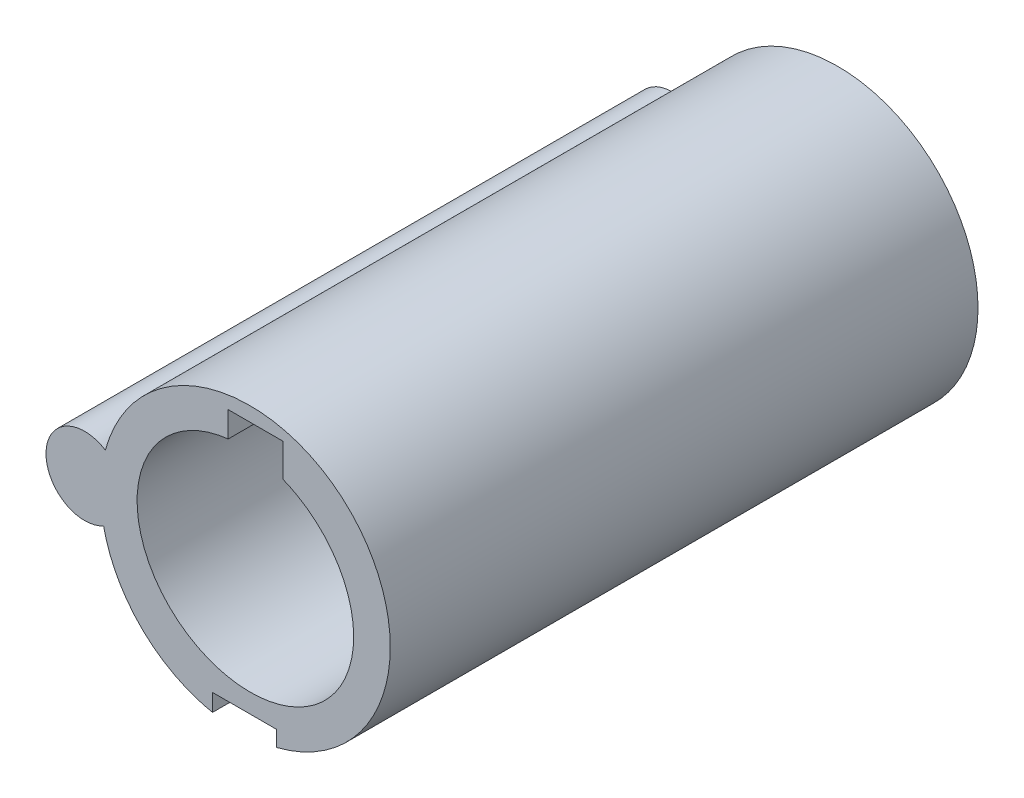
ISO-10303-21;
HEADER;
FILE_DESCRIPTION(('STEP AP214'),'2;1');
FILE_NAME('part.step','',(''),(''),'','','');
FILE_SCHEMA(('AUTOMOTIVE_DESIGN { 1 0 10303 214 1 1 1 1 }'));
ENDSEC;
DATA;
#1=APPLICATION_CONTEXT('core data for automotive mechanical design processes');
#2=APPLICATION_PROTOCOL_DEFINITION('international standard','automotive_design',2000,#1);
#3=PRODUCT_CONTEXT('',#1,'mechanical');
#4=PRODUCT('Part','Part','',(#3));
#5=PRODUCT_RELATED_PRODUCT_CATEGORY('part','',(#4));
#6=PRODUCT_DEFINITION_FORMATION('','',#4);
#7=PRODUCT_DEFINITION_CONTEXT('part definition',#1,'design');
#8=PRODUCT_DEFINITION('design','',#6,#7);
#9=PRODUCT_DEFINITION_SHAPE('','',#8);
#10=(LENGTH_UNIT() NAMED_UNIT(*) SI_UNIT(.MILLI.,.METRE.));
#11=(NAMED_UNIT(*) PLANE_ANGLE_UNIT() SI_UNIT($,.RADIAN.));
#12=(NAMED_UNIT(*) SI_UNIT($,.STERADIAN.) SOLID_ANGLE_UNIT());
#13=UNCERTAINTY_MEASURE_WITH_UNIT(LENGTH_MEASURE(1.E-05),#10,'distance_accuracy_value','');
#14=(GEOMETRIC_REPRESENTATION_CONTEXT(3) GLOBAL_UNCERTAINTY_ASSIGNED_CONTEXT((#13)) GLOBAL_UNIT_ASSIGNED_CONTEXT((#10,
#11,#12)) REPRESENTATION_CONTEXT('',''));
#15=CARTESIAN_POINT('',(0.,0.,0.));
#16=DIRECTION('',(0.,0.,1.));
#17=DIRECTION('',(1.,0.,0.));
#18=AXIS2_PLACEMENT_3D('',#15,#16,#17);
#19=CARTESIAN_POINT('',(0.,0.,170.));
#20=DIRECTION('',(0.,0.,1.));
#21=DIRECTION('',(0.795431720032498,0.606043215262857,0.));
#22=AXIS2_PLACEMENT_3D('',#19,#20,#21);
#23=ELLIPSE('',#22,42.3968647187602,41.0291122225245);
#24=DIRECTION('',(0.,0.,-1.));
#25=VECTOR('',#24,1.);
#26=SURFACE_OF_LINEAR_EXTRUSION('',#23,#25);
#27=CARTESIAN_POINT('',(0.,0.,0.));
#28=DIRECTION('',(0.,0.,1.));
#29=DIRECTION('',(0.795431720032498,0.606043215262857,0.));
#30=AXIS2_PLACEMENT_3D('',#27,#28,#29);
#31=ELLIPSE('',#30,42.3968647187602,41.0291122225245);
#32=CARTESIAN_POINT('',(9.05597585206664,-40.2509189524476,0.));
#33=VERTEX_POINT('',#32);
#34=CARTESIAN_POINT('',(-40.4798539783786,9.44768805392926,0.));
#35=VERTEX_POINT('',#34);
#36=EDGE_CURVE('E120',#33,#35,#31,.T.);
#37=ORIENTED_EDGE('',*,*,#36,.T.);
#38=DIRECTION('',(0.,0.,-1.));
#39=VECTOR('',#38,1.);
#40=CARTESIAN_POINT('',(-40.4798539783786,9.44768805392926,170.));
#41=LINE('',#40,#39);
#42=CARTESIAN_POINT('',(-40.4798539783786,9.44768805392926,170.));
#43=VERTEX_POINT('',#42);
#44=EDGE_CURVE('E11',#35,#43,#41,.F.);
#45=ORIENTED_EDGE('',*,*,#44,.T.);
#46=CARTESIAN_POINT('',(9.05597585206668,-40.2509189524476,170.));
#47=VERTEX_POINT('',#46);
#48=EDGE_CURVE('E118',#47,#43,#23,.T.);
#49=ORIENTED_EDGE('',*,*,#48,.F.);
#50=DIRECTION('',(0.,0.,-1.));
#51=VECTOR('',#50,1.);
#52=CARTESIAN_POINT('',(9.05597585206667,-40.2509189524476,170.));
#53=LINE('',#52,#51);
#54=EDGE_CURVE('E138',#47,#33,#53,.T.);
#55=ORIENTED_EDGE('',*,*,#54,.T.);
#56=EDGE_LOOP('',(#37,#45,#49,#55));
#57=FACE_BOUND('',#56,.T.);
#58=ADVANCED_FACE('F33',(#57),#26,.F.);
#59=CARTESIAN_POINT('',(0.,0.,170.));
#60=DIRECTION('',(0.,0.,1.));
#61=DIRECTION('',(1.,0.,0.));
#62=AXIS2_PLACEMENT_3D('',#59,#60,#61);
#63=PLANE('',#62);
#64=ORIENTED_EDGE('',*,*,#48,.T.);
#65=CARTESIAN_POINT('',(-46.4822943247072,0.,170.));
#66=DIRECTION('',(0.,0.,1.));
#67=DIRECTION('',(1.,0.,0.));
#68=AXIS2_PLACEMENT_3D('',#65,#66,#67);
#69=CIRCLE('',#68,11.1932166813473);
#70=CARTESIAN_POINT('',(-41.0158018376796,-9.76757695464242,170.));
#71=VERTEX_POINT('',#70);
#72=EDGE_CURVE('E49',#43,#71,#69,.T.);
#73=ORIENTED_EDGE('',*,*,#72,.T.);
#74=CARTESIAN_POINT('',(-9.4977307716797,-40.7328716216063,170.));
#75=VERTEX_POINT('',#74);
#76=EDGE_CURVE('E127',#71,#75,#23,.T.);
#77=ORIENTED_EDGE('',*,*,#76,.T.);
#78=DIRECTION('',(0.,-1.,0.));
#79=VECTOR('',#78,1.);
#80=CARTESIAN_POINT('',(-9.4977307716797,-35.7269291237015,170.));
#81=LINE('',#80,#79);
#82=CARTESIAN_POINT('',(-9.4977307716797,-35.7269291237015,170.));
#83=VERTEX_POINT('',#82);
#84=EDGE_CURVE('E303',#83,#75,#81,.T.);
#85=ORIENTED_EDGE('',*,*,#84,.F.);
#86=DIRECTION('',(-1.,0.,0.));
#87=VECTOR('',#86,1.);
#88=CARTESIAN_POINT('',(-9.4977307716797,-35.7269291237015,170.));
#89=LINE('',#88,#87);
#90=CARTESIAN_POINT('',(9.05597585206668,-35.7269291237015,170.));
#91=VERTEX_POINT('',#90);
#92=EDGE_CURVE('E299',#91,#83,#89,.T.);
#93=ORIENTED_EDGE('',*,*,#92,.F.);
#94=DIRECTION('',(0.,1.,0.));
#95=VECTOR('',#94,1.);
#96=CARTESIAN_POINT('',(9.05597585206668,-35.7269291237015,170.));
#97=LINE('',#96,#95);
#98=EDGE_CURVE('E125',#47,#91,#97,.T.);
#99=ORIENTED_EDGE('',*,*,#98,.F.);
#100=EDGE_LOOP('',(#64,#73,#77,#85,#93,#99));
#101=FACE_BOUND('',#100,.T.);
#102=DIRECTION('',(0.,-1.,0.));
#103=VECTOR('',#102,1.);
#104=CARTESIAN_POINT('',(-4.96974284564636,37.3835100722515,170.));
#105=LINE('',#104,#103);
#106=CARTESIAN_POINT('',(-4.96974284564636,37.3835100722515,170.));
#107=VERTEX_POINT('',#106);
#108=CARTESIAN_POINT('',(-4.96974284564636,30.0232337636321,170.));
#109=VERTEX_POINT('',#108);
#110=EDGE_CURVE('E276',#107,#109,#105,.T.);
#111=ORIENTED_EDGE('',*,*,#110,.F.);
#112=DIRECTION('',(-1.,0.,0.));
#113=VECTOR('',#112,1.);
#114=CARTESIAN_POINT('',(-4.96974284564636,37.3835100722515,170.));
#115=LINE('',#114,#113);
#116=CARTESIAN_POINT('',(10.8229955305187,37.3835100722515,170.));
#117=VERTEX_POINT('',#116);
#118=EDGE_CURVE('E282',#117,#107,#115,.T.);
#119=ORIENTED_EDGE('',*,*,#118,.F.);
#120=DIRECTION('',(0.,1.,0.));
#121=VECTOR('',#120,1.);
#122=CARTESIAN_POINT('',(10.8229955305187,37.3835100722515,170.));
#123=LINE('',#122,#121);
#124=CARTESIAN_POINT('',(10.8229955305187,27.8588450600018,170.));
#125=VERTEX_POINT('',#124);
#126=EDGE_CURVE('E285',#125,#117,#123,.T.);
#127=ORIENTED_EDGE('',*,*,#126,.F.);
#128=CARTESIAN_POINT('',(0.,0.,170.));
#129=DIRECTION('',(0.,0.,1.));
#130=DIRECTION('',(0.900460492349972,-0.434937813620344,0.));
#131=AXIS2_PLACEMENT_3D('',#128,#129,#130);
#132=ELLIPSE('',#131,31.6486344608763,29.8770924369327);
#133=EDGE_CURVE('E152',#109,#125,#132,.T.);
#134=ORIENTED_EDGE('',*,*,#133,.F.);
#135=EDGE_LOOP('',(#111,#119,#127,#134));
#136=FACE_BOUND('',#135,.T.);
#137=ADVANCED_FACE('F122',(#101,#136),#63,.T.);
#138=CARTESIAN_POINT('',(0.,0.,0.));
#139=DIRECTION('',(0.,0.,1.));
#140=DIRECTION('',(1.,0.,0.));
#141=AXIS2_PLACEMENT_3D('',#138,#139,#140);
#142=PLANE('',#141);
#143=CARTESIAN_POINT('',(-41.0158018376796,-9.76757695464241,0.));
#144=VERTEX_POINT('',#143);
#145=CARTESIAN_POINT('',(-9.4977307716797,-40.7328716216063,0.));
#146=VERTEX_POINT('',#145);
#147=EDGE_CURVE('E135',#144,#146,#31,.T.);
#148=ORIENTED_EDGE('',*,*,#147,.F.);
#149=CARTESIAN_POINT('',(-46.4822943247072,0.,0.));
#150=DIRECTION('',(0.,0.,1.));
#151=DIRECTION('',(1.,0.,0.));
#152=AXIS2_PLACEMENT_3D('',#149,#150,#151);
#153=CIRCLE('',#152,11.1932166813473);
#154=EDGE_CURVE('E113',#35,#144,#153,.T.);
#155=ORIENTED_EDGE('',*,*,#154,.F.);
#156=ORIENTED_EDGE('',*,*,#36,.F.);
#157=DIRECTION('',(0.,1.,0.));
#158=VECTOR('',#157,1.);
#159=CARTESIAN_POINT('',(9.05597585206668,-35.7269291237015,0.));
#160=LINE('',#159,#158);
#161=CARTESIAN_POINT('',(9.05597585206668,-35.7269291237015,0.));
#162=VERTEX_POINT('',#161);
#163=EDGE_CURVE('E57',#33,#162,#160,.T.);
#164=ORIENTED_EDGE('',*,*,#163,.T.);
#165=DIRECTION('',(-1.,0.,0.));
#166=VECTOR('',#165,1.);
#167=CARTESIAN_POINT('',(-9.4977307716797,-35.7269291237015,0.));
#168=LINE('',#167,#166);
#169=CARTESIAN_POINT('',(-9.4977307716797,-35.7269291237015,0.));
#170=VERTEX_POINT('',#169);
#171=EDGE_CURVE('E301',#162,#170,#168,.T.);
#172=ORIENTED_EDGE('',*,*,#171,.T.);
#173=DIRECTION('',(0.,-1.,0.));
#174=VECTOR('',#173,1.);
#175=CARTESIAN_POINT('',(-9.4977307716797,-35.7269291237015,0.));
#176=LINE('',#175,#174);
#177=EDGE_CURVE('E151',#170,#146,#176,.T.);
#178=ORIENTED_EDGE('',*,*,#177,.T.);
#179=EDGE_LOOP('',(#148,#155,#156,#164,#172,#178));
#180=FACE_BOUND('',#179,.T.);
#181=DIRECTION('',(-1.,0.,0.));
#182=VECTOR('',#181,1.);
#183=CARTESIAN_POINT('',(-4.96974284564636,37.3835100722515,0.));
#184=LINE('',#183,#182);
#185=CARTESIAN_POINT('',(10.8229955305187,37.3835100722515,0.));
#186=VERTEX_POINT('',#185);
#187=CARTESIAN_POINT('',(-4.96974284564636,37.3835100722515,0.));
#188=VERTEX_POINT('',#187);
#189=EDGE_CURVE('E280',#186,#188,#184,.T.);
#190=ORIENTED_EDGE('',*,*,#189,.T.);
#191=DIRECTION('',(0.,-1.,0.));
#192=VECTOR('',#191,1.);
#193=CARTESIAN_POINT('',(-4.96974284564636,37.3835100722515,0.));
#194=LINE('',#193,#192);
#195=CARTESIAN_POINT('',(-4.96974284564636,30.0232337636321,0.));
#196=VERTEX_POINT('',#195);
#197=EDGE_CURVE('E273',#188,#196,#194,.T.);
#198=ORIENTED_EDGE('',*,*,#197,.T.);
#199=CARTESIAN_POINT('',(0.,0.,0.));
#200=DIRECTION('',(0.,0.,1.));
#201=DIRECTION('',(0.900460492349972,-0.434937813620344,0.));
#202=AXIS2_PLACEMENT_3D('',#199,#200,#201);
#203=ELLIPSE('',#202,31.6486344608763,29.8770924369327);
#204=CARTESIAN_POINT('',(10.8229955305187,27.8588450600018,0.));
#205=VERTEX_POINT('',#204);
#206=EDGE_CURVE('E133',#196,#205,#203,.T.);
#207=ORIENTED_EDGE('',*,*,#206,.T.);
#208=DIRECTION('',(0.,1.,0.));
#209=VECTOR('',#208,1.);
#210=CARTESIAN_POINT('',(10.8229955305187,37.3835100722515,0.));
#211=LINE('',#210,#209);
#212=EDGE_CURVE('E281',#205,#186,#211,.T.);
#213=ORIENTED_EDGE('',*,*,#212,.T.);
#214=EDGE_LOOP('',(#190,#198,#207,#213));
#215=FACE_BOUND('',#214,.T.);
#216=ADVANCED_FACE('F147',(#180,#215),#142,.F.);
#217=ORIENTED_EDGE('',*,*,#76,.F.);
#218=DIRECTION('',(0.,0.,-1.));
#219=VECTOR('',#218,1.);
#220=CARTESIAN_POINT('',(-41.0158018376796,-9.76757695464242,170.));
#221=LINE('',#220,#219);
#222=EDGE_CURVE('E42',#71,#144,#221,.T.);
#223=ORIENTED_EDGE('',*,*,#222,.T.);
#224=ORIENTED_EDGE('',*,*,#147,.T.);
#225=DIRECTION('',(0.,0.,-1.));
#226=VECTOR('',#225,1.);
#227=CARTESIAN_POINT('',(-9.4977307716797,-40.7328716216063,170.));
#228=LINE('',#227,#226);
#229=EDGE_CURVE('E140',#146,#75,#228,.F.);
#230=ORIENTED_EDGE('',*,*,#229,.T.);
#231=EDGE_LOOP('',(#217,#223,#224,#230));
#232=FACE_BOUND('',#231,.T.);
#233=ADVANCED_FACE('F35',(#232),#26,.F.);
#234=DIRECTION('',(0.,0.,-1.));
#235=VECTOR('',#234,1.);
#236=SURFACE_OF_LINEAR_EXTRUSION('',#132,#235);
#237=DIRECTION('',(0.,0.,-1.));
#238=VECTOR('',#237,1.);
#239=CARTESIAN_POINT('',(-4.96974284564636,30.0232337636321,170.));
#240=LINE('',#239,#238);
#241=EDGE_CURVE('E128',#109,#196,#240,.T.);
#242=ORIENTED_EDGE('',*,*,#241,.F.);
#243=ORIENTED_EDGE('',*,*,#133,.T.);
#244=DIRECTION('',(0.,0.,-1.));
#245=VECTOR('',#244,1.);
#246=CARTESIAN_POINT('',(10.8229955305187,27.8588450600018,170.));
#247=LINE('',#246,#245);
#248=EDGE_CURVE('E126',#205,#125,#247,.F.);
#249=ORIENTED_EDGE('',*,*,#248,.F.);
#250=ORIENTED_EDGE('',*,*,#206,.F.);
#251=EDGE_LOOP('',(#242,#243,#249,#250));
#252=FACE_BOUND('',#251,.T.);
#253=ADVANCED_FACE('F165',(#252),#236,.T.);
#254=CARTESIAN_POINT('',(-4.96974284564636,37.3835100722515,0.));
#255=DIRECTION('',(-1.,0.,0.));
#256=DIRECTION('',(0.,0.,1.));
#257=AXIS2_PLACEMENT_3D('',#254,#255,#256);
#258=PLANE('',#257);
#259=ORIENTED_EDGE('',*,*,#241,.T.);
#260=ORIENTED_EDGE('',*,*,#197,.F.);
#261=DIRECTION('',(0.,0.,1.));
#262=VECTOR('',#261,1.);
#263=CARTESIAN_POINT('',(-4.96974284564636,37.3835100722515,0.));
#264=LINE('',#263,#262);
#265=EDGE_CURVE('E159',#188,#107,#264,.T.);
#266=ORIENTED_EDGE('',*,*,#265,.T.);
#267=ORIENTED_EDGE('',*,*,#110,.T.);
#268=EDGE_LOOP('',(#259,#260,#266,#267));
#269=FACE_BOUND('',#268,.T.);
#270=ADVANCED_FACE('F169',(#269),#258,.F.);
#271=CARTESIAN_POINT('',(-4.96974284564636,37.3835100722515,0.));
#272=DIRECTION('',(0.,1.,0.));
#273=DIRECTION('',(0.,0.,1.));
#274=AXIS2_PLACEMENT_3D('',#271,#272,#273);
#275=PLANE('',#274);
#276=ORIENTED_EDGE('',*,*,#118,.T.);
#277=ORIENTED_EDGE('',*,*,#265,.F.);
#278=ORIENTED_EDGE('',*,*,#189,.F.);
#279=DIRECTION('',(0.,0.,1.));
#280=VECTOR('',#279,1.);
#281=CARTESIAN_POINT('',(10.8229955305187,37.3835100722515,0.));
#282=LINE('',#281,#280);
#283=EDGE_CURVE('E296',#186,#117,#282,.T.);
#284=ORIENTED_EDGE('',*,*,#283,.T.);
#285=EDGE_LOOP('',(#276,#277,#278,#284));
#286=FACE_BOUND('',#285,.T.);
#287=ADVANCED_FACE('F234',(#286),#275,.F.);
#288=CARTESIAN_POINT('',(10.8229955305187,37.3835100722515,0.));
#289=DIRECTION('',(1.,0.,0.));
#290=DIRECTION('',(0.,0.,-1.));
#291=AXIS2_PLACEMENT_3D('',#288,#289,#290);
#292=PLANE('',#291);
#293=ORIENTED_EDGE('',*,*,#248,.T.);
#294=ORIENTED_EDGE('',*,*,#126,.T.);
#295=ORIENTED_EDGE('',*,*,#283,.F.);
#296=ORIENTED_EDGE('',*,*,#212,.F.);
#297=EDGE_LOOP('',(#293,#294,#295,#296));
#298=FACE_BOUND('',#297,.T.);
#299=ADVANCED_FACE('F227',(#298),#292,.F.);
#300=CARTESIAN_POINT('',(-9.4977307716797,-35.7269291237015,0.));
#301=DIRECTION('',(-1.,0.,0.));
#302=DIRECTION('',(0.,0.,1.));
#303=AXIS2_PLACEMENT_3D('',#300,#301,#302);
#304=PLANE('',#303);
#305=ORIENTED_EDGE('',*,*,#177,.F.);
#306=DIRECTION('',(0.,0.,1.));
#307=VECTOR('',#306,1.);
#308=CARTESIAN_POINT('',(-9.4977307716797,-35.7269291237015,0.));
#309=LINE('',#308,#307);
#310=EDGE_CURVE('E291',#170,#83,#309,.T.);
#311=ORIENTED_EDGE('',*,*,#310,.T.);
#312=ORIENTED_EDGE('',*,*,#84,.T.);
#313=ORIENTED_EDGE('',*,*,#229,.F.);
#314=EDGE_LOOP('',(#305,#311,#312,#313));
#315=FACE_BOUND('',#314,.T.);
#316=ADVANCED_FACE('F170',(#315),#304,.F.);
#317=CARTESIAN_POINT('',(9.05597585206668,-35.7269291237015,0.));
#318=DIRECTION('',(1.,0.,0.));
#319=DIRECTION('',(0.,0.,-1.));
#320=AXIS2_PLACEMENT_3D('',#317,#318,#319);
#321=PLANE('',#320);
#322=ORIENTED_EDGE('',*,*,#98,.T.);
#323=DIRECTION('',(0.,0.,1.));
#324=VECTOR('',#323,1.);
#325=CARTESIAN_POINT('',(9.05597585206668,-35.7269291237015,0.));
#326=LINE('',#325,#324);
#327=EDGE_CURVE('E162',#162,#91,#326,.T.);
#328=ORIENTED_EDGE('',*,*,#327,.F.);
#329=ORIENTED_EDGE('',*,*,#163,.F.);
#330=ORIENTED_EDGE('',*,*,#54,.F.);
#331=EDGE_LOOP('',(#322,#328,#329,#330));
#332=FACE_BOUND('',#331,.T.);
#333=ADVANCED_FACE('F214',(#332),#321,.F.);
#334=CARTESIAN_POINT('',(-9.4977307716797,-35.7269291237015,0.));
#335=DIRECTION('',(0.,1.,0.));
#336=DIRECTION('',(0.,0.,1.));
#337=AXIS2_PLACEMENT_3D('',#334,#335,#336);
#338=PLANE('',#337);
#339=ORIENTED_EDGE('',*,*,#92,.T.);
#340=ORIENTED_EDGE('',*,*,#310,.F.);
#341=ORIENTED_EDGE('',*,*,#171,.F.);
#342=ORIENTED_EDGE('',*,*,#327,.T.);
#343=EDGE_LOOP('',(#339,#340,#341,#342));
#344=FACE_BOUND('',#343,.T.);
#345=ADVANCED_FACE('F206',(#344),#338,.F.);
#346=CARTESIAN_POINT('',(-46.4822943247072,0.,0.));
#347=DIRECTION('',(0.,0.,1.));
#348=DIRECTION('',(1.,0.,0.));
#349=AXIS2_PLACEMENT_3D('',#346,#347,#348);
#350=CYLINDRICAL_SURFACE('',#349,11.1932166813473);
#351=ORIENTED_EDGE('',*,*,#44,.F.);
#352=ORIENTED_EDGE('',*,*,#154,.T.);
#353=ORIENTED_EDGE('',*,*,#222,.F.);
#354=ORIENTED_EDGE('',*,*,#72,.F.);
#355=EDGE_LOOP('',(#351,#352,#353,#354));
#356=FACE_BOUND('',#355,.T.);
#357=ADVANCED_FACE('F109',(#356),#350,.T.);
#358=CLOSED_SHELL('',(#58,#137,#216,#233,#253,#270,#287,#299,#316,#333,#345,#357));
#359=MANIFOLD_SOLID_BREP('B2',#358);
#360=ADVANCED_BREP_SHAPE_REPRESENTATION('',(#18,#359),#14);
#361=SHAPE_DEFINITION_REPRESENTATION(#9,#360);
ENDSEC;
END-ISO-10303-21;
